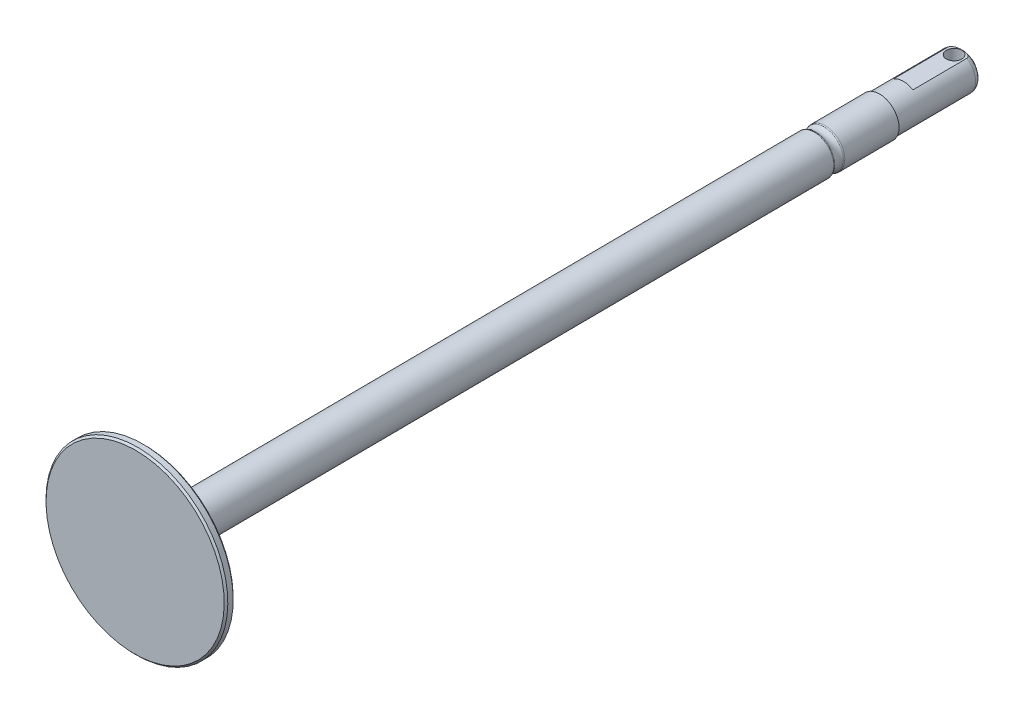
ISO-10303-21;
HEADER;
FILE_DESCRIPTION(('STEP AP214'),'2;1');
FILE_NAME('part.step','',(''),(''),'','','');
FILE_SCHEMA(('AUTOMOTIVE_DESIGN { 1 0 10303 214 1 1 1 1 }'));
ENDSEC;
DATA;
#1=APPLICATION_CONTEXT('core data for automotive mechanical design processes');
#2=APPLICATION_PROTOCOL_DEFINITION('international standard','automotive_design',2000,#1);
#3=PRODUCT_CONTEXT('',#1,'mechanical');
#4=PRODUCT('Part','Part','',(#3));
#5=PRODUCT_RELATED_PRODUCT_CATEGORY('part','',(#4));
#6=PRODUCT_DEFINITION_FORMATION('','',#4);
#7=PRODUCT_DEFINITION_CONTEXT('part definition',#1,'design');
#8=PRODUCT_DEFINITION('design','',#6,#7);
#9=PRODUCT_DEFINITION_SHAPE('','',#8);
#10=(LENGTH_UNIT() NAMED_UNIT(*) SI_UNIT(.MILLI.,.METRE.));
#11=(NAMED_UNIT(*) PLANE_ANGLE_UNIT() SI_UNIT($,.RADIAN.));
#12=(NAMED_UNIT(*) SI_UNIT($,.STERADIAN.) SOLID_ANGLE_UNIT());
#13=UNCERTAINTY_MEASURE_WITH_UNIT(LENGTH_MEASURE(1.E-05),#10,'distance_accuracy_value','');
#14=(GEOMETRIC_REPRESENTATION_CONTEXT(3) GLOBAL_UNCERTAINTY_ASSIGNED_CONTEXT((#13)) GLOBAL_UNIT_ASSIGNED_CONTEXT((#10,
#11,#12)) REPRESENTATION_CONTEXT('',''));
#15=CARTESIAN_POINT('',(0.,0.,0.));
#16=DIRECTION('',(0.,0.,1.));
#17=DIRECTION('',(1.,0.,0.));
#18=AXIS2_PLACEMENT_3D('',#15,#16,#17);
#19=CARTESIAN_POINT('',(6.47143842973443,0.,32.4994135551274));
#20=DIRECTION('',(-0.00691899399214713,0.,-0.99997606347459));
#21=DIRECTION('',(-0.99997606347459,0.,0.00691899399214713));
#22=AXIS2_PLACEMENT_3D('',#19,#20,#21);
#23=CYLINDRICAL_SURFACE('',#22,3.25);
#24=CARTESIAN_POINT('',(6.46400751984752,0.,31.4254522215181));
#25=DIRECTION('',(-0.00691899399214887,0.,-0.99997606347459));
#26=DIRECTION('',(-0.99997606347459,0.,0.00691899399214899));
#27=AXIS2_PLACEMENT_3D('',#24,#25,#26);
#28=CIRCLE('',#27,3.25000000000171);
#29=CARTESIAN_POINT('',(3.21408531355339,0.,31.4479389519926));
#30=VERTEX_POINT('',#29);
#31=EDGE_CURVE('E323',#30,#30,#28,.T.);
#32=ORIENTED_EDGE('',*,*,#31,.F.);
#33=EDGE_LOOP('',(#32));
#34=FACE_BOUND('',#33,.T.);
#35=CARTESIAN_POINT('',(7.20658154140015,0.,138.746870299357));
#36=DIRECTION('',(0.00691899399214702,0.,0.99997606347459));
#37=DIRECTION('',(0.99997606347459,0.,-0.00691899399214702));
#38=AXIS2_PLACEMENT_3D('',#35,#36,#37);
#39=CIRCLE('',#38,3.25);
#40=CARTESIAN_POINT('',(10.4565037476926,0.,138.724383568882));
#41=VERTEX_POINT('',#40);
#42=EDGE_CURVE('E322',#41,#41,#39,.F.);
#43=ORIENTED_EDGE('',*,*,#42,.T.);
#44=EDGE_LOOP('',(#43));
#45=FACE_BOUND('',#44,.T.);
#46=ADVANCED_FACE('F43',(#34,#45),#23,.T.);
#47=CARTESIAN_POINT('',(6.46400751984752,0.,31.4254522215181));
#48=DIRECTION('',(-0.00691899399214887,0.,-0.99997606347459));
#49=DIRECTION('',(-0.99997606347459,0.,0.00691899399214887));
#50=AXIS2_PLACEMENT_3D('',#47,#48,#49);
#51=TOROIDAL_SURFACE('',#50,2.95000000000171,0.3);
#52=ORIENTED_EDGE('',*,*,#31,.T.);
#53=EDGE_LOOP('',(#52));
#54=FACE_BOUND('',#53,.T.);
#55=CARTESIAN_POINT('',(6.46263457453887,0.,31.2270256229448));
#56=DIRECTION('',(0.00691899399215062,0.,0.99997606347459));
#57=DIRECTION('',(0.99997606347459,0.,-0.00691899399215068));
#58=AXIS2_PLACEMENT_3D('',#55,#56,#57);
#59=CIRCLE('',#58,3.17500000000299);
#60=CARTESIAN_POINT('',(9.63755857607368,0.,31.2050578170197));
#61=VERTEX_POINT('',#60);
#62=EDGE_CURVE('E138',#61,#61,#59,.T.);
#63=ORIENTED_EDGE('',*,*,#62,.T.);
#64=EDGE_LOOP('',(#63));
#65=FACE_BOUND('',#64,.T.);
#66=ADVANCED_FACE('F162',(#54,#65),#51,.T.);
#67=CARTESIAN_POINT('',(6.28462559194646,0.,5.50005984131344));
#68=DIRECTION('',(-0.00691899399214713,0.,-0.99997606347459));
#69=DIRECTION('',(-0.99997606347459,0.,0.00691899399214713));
#70=AXIS2_PLACEMENT_3D('',#67,#68,#69);
#71=PLANE('',#70);
#72=CARTESIAN_POINT('',(6.28462559194637,0.,5.50005984131344));
#73=DIRECTION('',(0.00691899399214713,0.,0.99997606347459));
#74=DIRECTION('',(0.99997606347459,0.,-0.00691899399214747));
#75=AXIS2_PLACEMENT_3D('',#72,#73,#74);
#76=CIRCLE('',#75,0.716666666666764);
#77=CARTESIAN_POINT('',(7.00127510410326,0.,5.4951012289524));
#78=VERTEX_POINT('',#77);
#79=CARTESIAN_POINT('',(5.56797607978949,0.,5.50501845367448));
#80=VERTEX_POINT('',#79);
#81=EDGE_CURVE('E133',#78,#80,#76,.T.);
#82=ORIENTED_EDGE('',*,*,#81,.F.);
#83=CARTESIAN_POINT('',(6.28462559194637,0.,5.50005984131344));
#84=DIRECTION('',(0.00691899399214713,0.,0.99997606347459));
#85=DIRECTION('',(-0.99997606347459,0.,0.00691899399214747));
#86=AXIS2_PLACEMENT_3D('',#83,#84,#85);
#87=CIRCLE('',#86,0.716666666666764);
#88=EDGE_CURVE('E128',#80,#78,#87,.T.);
#89=ORIENTED_EDGE('',*,*,#88,.F.);
#90=EDGE_LOOP('',(#82,#89));
#91=FACE_BOUND('',#90,.T.);
#92=ADVANCED_FACE('F142',(#91),#71,.T.);
#93=CARTESIAN_POINT('',(6.45760044174673,0.,30.4994614281782));
#94=DIRECTION('',(0.00691899399215062,0.,0.99997606347459));
#95=DIRECTION('',(0.99997606347459,0.,-0.00691899399215062));
#96=AXIS2_PLACEMENT_3D('',#93,#94,#95);
#97=TOROIDAL_SURFACE('',#96,4.00000000000341,1.1);
#98=ORIENTED_EDGE('',*,*,#62,.F.);
#99=EDGE_LOOP('',(#98));
#100=FACE_BOUND('',#99,.T.);
#101=CARTESIAN_POINT('',(6.45256630895634,0.,29.7718972334184));
#102=DIRECTION('',(0.00691899399214887,0.,0.99997606347459));
#103=DIRECTION('',(0.99997606347459,0.,-0.00691899399214876));
#104=AXIS2_PLACEMENT_3D('',#101,#102,#103);
#105=CIRCLE('',#104,3.17499999999869);
#106=CARTESIAN_POINT('',(9.62749031048685,0.,29.7499294274934));
#107=VERTEX_POINT('',#106);
#108=EDGE_CURVE('E144',#107,#107,#105,.F.);
#109=ORIENTED_EDGE('',*,*,#108,.F.);
#110=EDGE_LOOP('',(#109));
#111=FACE_BOUND('',#110,.T.);
#112=ADVANCED_FACE('F161',(#100,#111),#97,.F.);
#113=CARTESIAN_POINT('',(5.57489507378163,0.,6.50499451714907));
#114=DIRECTION('',(0.,1.,0.));
#115=DIRECTION('',(-0.99997606347459,0.,0.00691899399214713));
#116=AXIS2_PLACEMENT_3D('',#113,#114,#115);
#117=CIRCLE('',#116,1.);
#118=TRIMMED_CURVE('',#117,(PARAMETER_VALUE(-2.36980728294869)),
(PARAMETER_VALUE(2.36980728294869)),.T.,.PARAMETER.);
#119=CARTESIAN_POINT('',(6.29154458593852,0.,6.50003590478803));
#120=DIRECTION('',(-0.00691899399214713,0.,-0.99997606347459));
#121=AXIS1_PLACEMENT('',#119,#120);
#122=SURFACE_OF_REVOLUTION('',#118,#121);
#123=ORIENTED_EDGE('',*,*,#88,.T.);
#124=ORIENTED_EDGE('',*,*,#81,.T.);
#125=EDGE_LOOP('',(#123,#124));
#126=FACE_BOUND('',#125,.T.);
#127=CARTESIAN_POINT('',(6.28600939074497,0.,5.70005505403319));
#128=DIRECTION('',(0.00691899399215062,0.,0.99997606347459));
#129=DIRECTION('',(0.99997606347459,0.,-0.00691899399214976));
#130=AXIS2_PLACEMENT_3D('',#127,#128,#129);
#131=CIRCLE('',#130,1.31666666663942);
#132=CARTESIAN_POINT('',(7.60264454095926,0.,5.69094504527704));
#133=VERTEX_POINT('',#132);
#134=EDGE_CURVE('E192',#133,#133,#131,.T.);
#135=ORIENTED_EDGE('',*,*,#134,.F.);
#136=EDGE_LOOP('',(#135));
#137=FACE_BOUND('',#136,.T.);
#138=ADVANCED_FACE('F131',(#126,#137),#122,.F.);
#139=CARTESIAN_POINT('',(6.45119336364939,0.,29.573470634846));
#140=DIRECTION('',(0.00691899399214887,0.,0.99997606347459));
#141=DIRECTION('',(0.99997606347459,0.,-0.00691899399214887));
#142=AXIS2_PLACEMENT_3D('',#139,#140,#141);
#143=TOROIDAL_SURFACE('',#142,2.9499999999983,0.3);
#144=CARTESIAN_POINT('',(6.4511933636511,0.,29.573470634846));
#145=DIRECTION('',(-0.00691899399214713,0.,-0.99997606347459));
#146=DIRECTION('',(-0.99997606347459,0.,0.00691899399214713));
#147=AXIS2_PLACEMENT_3D('',#144,#145,#146);
#148=CIRCLE('',#147,3.25);
#149=CARTESIAN_POINT('',(3.20127115735869,0.,29.5959573653205));
#150=VERTEX_POINT('',#149);
#151=EDGE_CURVE('E199',#150,#150,#148,.T.);
#152=ORIENTED_EDGE('',*,*,#151,.F.);
#153=EDGE_LOOP('',(#152));
#154=FACE_BOUND('',#153,.T.);
#155=ORIENTED_EDGE('',*,*,#108,.T.);
#156=EDGE_LOOP('',(#155));
#157=FACE_BOUND('',#156,.T.);
#158=ADVANCED_FACE('F186',(#154,#157),#143,.T.);
#159=CARTESIAN_POINT('',(6.30192307692334,-3.24999999999998,7.99999999999993));
#160=DIRECTION('',(0.,1.,0.));
#161=DIRECTION('',(-0.99997606347459,0.,0.00691899399214713));
#162=AXIS2_PLACEMENT_3D('',#159,#160,#161);
#163=CYLINDRICAL_SURFACE('',#162,1.275);
#164=CARTESIAN_POINT('',(6.30192307692334,2.60000000000002,7.99999999999993));
#165=DIRECTION('',(0.,1.,0.));
#166=DIRECTION('',(-0.99997606347459,0.,0.00691899399214713));
#167=AXIS2_PLACEMENT_3D('',#164,#165,#166);
#168=CIRCLE('',#167,1.275);
#169=CARTESIAN_POINT('',(5.02695359599324,2.60000000000002,8.00882171733992));
#170=VERTEX_POINT('',#169);
#171=EDGE_CURVE('E196',#170,#170,#168,.T.);
#172=ORIENTED_EDGE('',*,*,#171,.T.);
#173=EDGE_LOOP('',(#172));
#174=FACE_BOUND('',#173,.T.);
#175=CARTESIAN_POINT('',(6.30192307692334,-2.59999999999998,7.99999999999993));
#176=DIRECTION('',(0.,1.,0.));
#177=DIRECTION('',(-0.99997606347459,0.,0.00691899399214713));
#178=AXIS2_PLACEMENT_3D('',#175,#176,#177);
#179=CIRCLE('',#178,1.275);
#180=CARTESIAN_POINT('',(5.02695359599324,-2.59999999999998,8.00882171733992));
#181=VERTEX_POINT('',#180);
#182=EDGE_CURVE('E223',#181,#181,#179,.F.);
#183=ORIENTED_EDGE('',*,*,#182,.T.);
#184=EDGE_LOOP('',(#183));
#185=FACE_BOUND('',#184,.T.);
#186=ADVANCED_FACE('F355',(#174,#185),#163,.F.);
#187=CARTESIAN_POINT('',(6.29292838473695,0.,6.70003111748414));
#188=DIRECTION('',(0.00691899399215105,0.,0.99997606347459));
#189=DIRECTION('',(0.99997606347459,0.,-0.00691899399215105));
#190=AXIS2_PLACEMENT_3D('',#187,#188,#189);
#191=CONICAL_SURFACE('',#190,2.64999999996017,0.92729521800843);
#192=CARTESIAN_POINT('',(6.29292838473695,0.,6.70003111748294));
#193=DIRECTION('',(-0.00691899399215062,0.,-0.99997606347459));
#194=DIRECTION('',(-0.99997606347459,0.,0.00691899399215105));
#195=AXIS2_PLACEMENT_3D('',#192,#193,#194);
#196=CIRCLE('',#195,2.65000000000009);
#197=CARTESIAN_POINT('',(5.78059311022955,2.60000000000002,6.7035760470267));
#198=VERTEX_POINT('',#197);
#199=CARTESIAN_POINT('',(5.78059311026074,-2.59999999999998,6.70357604703755));
#200=VERTEX_POINT('',#199);
#201=EDGE_CURVE('E203',#198,#200,#196,.F.);
#202=ORIENTED_EDGE('',*,*,#201,.F.);
#203=CARTESIAN_POINT('',(5.78059311023422,2.60000000000002,6.70357604705716));
#204=CARTESIAN_POINT('',(5.86552023323553,2.60000000000002,6.69061135992893));
#205=CARTESIAN_POINT('',(5.95092196332494,2.60000000000002,6.68062820190784));
#206=CARTESIAN_POINT('',(6.12176650438817,2.60000000000002,6.66690060894354));
#207=CARTESIAN_POINT('',(6.20720669140374,2.60000000000002,6.66312334195217));
#208=CARTESIAN_POINT('',(6.37813115349206,2.60000000000002,6.66194068831653));
#209=CARTESIAN_POINT('',(6.46361542856481,2.60000000000002,6.66453530167226));
#210=CARTESIAN_POINT('',(6.63463356984458,2.60000000000002,6.67589749217037));
#211=CARTESIAN_POINT('',(6.72016526666318,2.60000000000002,6.68469793452684));
#212=CARTESIAN_POINT('',(6.80526365921131,2.60000000000002,6.69648618797409));
#213=B_SPLINE_CURVE_WITH_KNOTS('',3,(#203,#204,#205,#206,#207,#208,#209,#210,#211,#212),
.UNSPECIFIED.,.F.,.F.,(4,2,2,2,4),(0.,0.257710646406221,0.514053441173921,0.770396235941627,
1.02810688234785),.UNSPECIFIED.);
#214=CARTESIAN_POINT('',(6.80526365921342,2.60000000000002,6.69648618795882));
#215=VERTEX_POINT('',#214);
#216=EDGE_CURVE('E204',#198,#215,#213,.T.);
#217=ORIENTED_EDGE('',*,*,#216,.T.);
#218=CARTESIAN_POINT('',(6.29292838473695,0.,6.70003111748294));
#219=DIRECTION('',(-0.00691899399215062,0.,-0.99997606347459));
#220=DIRECTION('',(-0.99997606347459,0.,0.00691899399215105));
#221=AXIS2_PLACEMENT_3D('',#218,#219,#220);
#222=CIRCLE('',#221,2.65000000000009);
#223=CARTESIAN_POINT('',(6.80526365921337,-2.59999999999998,6.69648618795881));
#224=VERTEX_POINT('',#223);
#225=EDGE_CURVE('E271',#224,#215,#222,.F.);
#226=ORIENTED_EDGE('',*,*,#225,.F.);
#227=CARTESIAN_POINT('',(6.80526365921122,-2.59999999999998,6.69648618797408));
#228=CARTESIAN_POINT('',(6.72016526666553,-2.59999999999998,6.68469793452717));
#229=CARTESIAN_POINT('',(6.63463356984939,-2.59999999999998,6.67589749217087));
#230=CARTESIAN_POINT('',(6.46361542857452,-2.59999999999998,6.66453530167273));
#231=CARTESIAN_POINT('',(6.3781311535042,-2.59999999999998,6.6619406883168));
#232=CARTESIAN_POINT('',(6.20720669142073,-2.59999999999998,6.66312334195169));
#233=CARTESIAN_POINT('',(6.12176650440756,-2.59999999999998,6.6669006089425));
#234=CARTESIAN_POINT('',(5.95092196334911,-2.59999999999998,6.68062820190536));
#235=CARTESIAN_POINT('',(5.86552023326208,-2.59999999999998,6.69061135992556));
#236=CARTESIAN_POINT('',(5.7805931102631,-2.59999999999998,6.70357604705277));
#237=B_SPLINE_CURVE_WITH_KNOTS('',3,(#227,#228,#229,#230,#231,#232,#233,#234,#235,#236),
.UNSPECIFIED.,.F.,.F.,(4,2,2,2,4),(0.,0.257710646398846,0.514053441159284,0.770396235919723,
1.02810688231857),.UNSPECIFIED.);
#238=EDGE_CURVE('E304',#224,#200,#237,.T.);
#239=ORIENTED_EDGE('',*,*,#238,.T.);
#240=EDGE_LOOP('',(#202,#217,#226,#239));
#241=FACE_BOUND('',#240,.T.);
#242=ORIENTED_EDGE('',*,*,#134,.T.);
#243=EDGE_LOOP('',(#242));
#244=FACE_BOUND('',#243,.T.);
#245=ADVANCED_FACE('F359',(#241,#244),#191,.T.);
#246=CARTESIAN_POINT('',(-10.1388705214707,3.25000000000002,16.6139599404043));
#247=DIRECTION('',(0.00691899399214713,0.,0.99997606347459));
#248=DIRECTION('',(0.99997606347459,0.,-0.00691899399214713));
#249=AXIS2_PLACEMENT_3D('',#246,#247,#248);
#250=PLANE('',#249);
#251=CARTESIAN_POINT('',(6.36073452586002,0.,16.499796539534));
#252=DIRECTION('',(0.00691899399215062,0.,0.99997606347459));
#253=DIRECTION('',(0.99997606347459,0.,-0.00691899399215062));
#254=AXIS2_PLACEMENT_3D('',#251,#252,#253);
#255=CIRCLE('',#254,3.05000000000008);
#256=CARTESIAN_POINT('',(7.95521823045706,2.60000000000002,16.4887640522819));
#257=VERTEX_POINT('',#256);
#258=CARTESIAN_POINT('',(4.76625082126298,2.60000000000002,16.5108290267861));
#259=VERTEX_POINT('',#258);
#260=EDGE_CURVE('E208',#257,#259,#255,.T.);
#261=ORIENTED_EDGE('',*,*,#260,.F.);
#262=DIRECTION('',(0.99997606347459,0.,-0.00691899399214713));
#263=VECTOR('',#262,1.);
#264=CARTESIAN_POINT('',(-10.1388705214707,2.60000000000002,16.6139599404045));
#265=LINE('',#264,#263);
#266=EDGE_CURVE('E114',#257,#259,#265,.F.);
#267=ORIENTED_EDGE('',*,*,#266,.T.);
#268=EDGE_LOOP('',(#261,#267));
#269=FACE_BOUND('',#268,.T.);
#270=ADVANCED_FACE('F261',(#269),#250,.F.);
#271=CARTESIAN_POINT('',(-10.1388705214707,2.60000000000002,16.6139599404043));
#272=DIRECTION('',(0.,-1.,0.));
#273=DIRECTION('',(-0.00691899399214713,0.,-0.99997606347459));
#274=AXIS2_PLACEMENT_3D('',#271,#272,#273);
#275=PLANE('',#274);
#276=CARTESIAN_POINT('',(4.70397987533363,2.60000000000002,7.5110444555147));
#277=CARTESIAN_POINT('',(4.70384987644721,2.60000000000002,7.49290841887377));
#278=CARTESIAN_POINT('',(4.70467367993067,2.60000000000002,7.4747792306576));
#279=CARTESIAN_POINT('',(4.70817762205473,2.60000000000002,7.43872032171689));
#280=CARTESIAN_POINT('',(4.71085575720852,2.60000000000002,7.42079040691319));
#281=CARTESIAN_POINT('',(4.72151035677255,2.60000000000002,7.36795172331959));
#282=CARTESIAN_POINT('',(4.73210683583856,2.60000000000002,7.33354430287102));
#283=CARTESIAN_POINT('',(4.75931961074297,2.60000000000002,7.26743057494155));
#284=CARTESIAN_POINT('',(4.77591271055891,2.60000000000002,7.23571443303589));
#285=CARTESIAN_POINT('',(4.81399534252052,2.60000000000002,7.17529865328853));
#286=CARTESIAN_POINT('',(4.83549871942386,2.60000000000002,7.14660788654726));
#287=CARTESIAN_POINT('',(4.89191934875167,2.60000000000002,7.08134381848383));
#288=CARTESIAN_POINT('',(4.92871113766357,2.60000000000002,7.04639998413353));
#289=CARTESIAN_POINT('',(5.00728682887246,2.60000000000002,6.98272702596022));
#290=CARTESIAN_POINT('',(5.04908010401538,2.60000000000001,6.95400986324759));
#291=CARTESIAN_POINT('',(5.16383022771077,2.60000000000001,6.88534773186314));
#292=CARTESIAN_POINT('',(5.23954402733486,2.60000000000002,6.850058458898));
#293=CARTESIAN_POINT('',(5.3952448432293,2.60000000000002,6.79081299539318));
#294=CARTESIAN_POINT('',(5.47524336906396,2.60000000000002,6.76688922834342));
#295=CARTESIAN_POINT('',(5.59338878295469,2.60000000000002,6.73829565222909));
#296=CARTESIAN_POINT('',(5.63075729257948,2.60000000000002,6.73021238396721));
#297=CARTESIAN_POINT('',(5.70558026739417,2.60000000000002,6.71571581567108));
#298=CARTESIAN_POINT('',(5.74303279523037,2.60000000000002,6.70929256443689));
#299=CARTESIAN_POINT('',(5.78059311022959,2.60000000000002,6.7035760470267));
#300=B_SPLINE_CURVE_WITH_KNOTS('',3,(#276,#277,#278,#279,#280,#281,#282,#283,#284,#285,#286,
#287,#288,#289,#290,#291,#292,#293,#294,#295,#296,#297,#298,#299),.UNSPECIFIED.,.F.,.F.,(4,2,2,
2,2,2,2,2,2,2,2,4),(0.,0.0543595006208801,0.108660360737125,0.215938070539347,0.322805175998552,
0.429977402492625,0.581352056766434,0.733014967075773,0.982209476205452,1.23211068022507,
1.34678143385737,1.46074793888463),.UNSPECIFIED.);
#301=CARTESIAN_POINT('',(4.70397987533363,2.60000000000002,7.5110444555147));
#302=VERTEX_POINT('',#301);
#303=EDGE_CURVE('E212',#302,#198,#300,.T.);
#304=ORIENTED_EDGE('',*,*,#303,.F.);
#305=DIRECTION('',(0.00691899399215062,0.,0.99997606347459));
#306=VECTOR('',#305,1.);
#307=CARTESIAN_POINT('',(11.8028677112802,2.59999999999979,1033.48648558044));
#308=LINE('',#307,#306);
#309=EDGE_CURVE('E213',#259,#302,#308,.F.);
#310=ORIENTED_EDGE('',*,*,#309,.F.);
#311=ORIENTED_EDGE('',*,*,#266,.F.);
#312=DIRECTION('',(0.00691899399215062,0.,0.99997606347459));
#313=VECTOR('',#312,1.);
#314=CARTESIAN_POINT('',(14.9918351204742,2.59999999999979,1033.46442060594));
#315=LINE('',#314,#313);
#316=CARTESIAN_POINT('',(7.8929472845277,2.60000000000002,7.48897948101051));
#317=VERTEX_POINT('',#316);
#318=EDGE_CURVE('E205',#317,#257,#315,.T.);
#319=ORIENTED_EDGE('',*,*,#318,.F.);
#320=CARTESIAN_POINT('',(6.80526365921553,2.60000000000002,6.69648618794356));
#321=CARTESIAN_POINT('',(6.8561154976496,2.60000000000002,6.70352634348705));
#322=CARTESIAN_POINT('',(6.9068293715514,2.60000000000002,6.71183531196478));
#323=CARTESIAN_POINT('',(7.00787456033053,2.60000000000002,6.73156842313693));
#324=CARTESIAN_POINT('',(7.05820318585411,2.60000000000002,6.74300620065973));
#325=CARTESIAN_POINT('',(7.15863558469799,2.60000000000002,6.76971330964486));
#326=CARTESIAN_POINT('',(7.20872559122189,2.60000000000002,6.78503563745771));
#327=CARTESIAN_POINT('',(7.30724687635603,2.60000000000002,6.82012973000199));
#328=CARTESIAN_POINT('',(7.35568118605749,2.60000000000002,6.83989279999233));
#329=CARTESIAN_POINT('',(7.4458536808667,2.60000000000002,6.8827245761694));
#330=CARTESIAN_POINT('',(7.48780361177337,2.60000000000003,6.9053405613773));
#331=CARTESIAN_POINT('',(7.56852650767192,2.60000000000001,6.95562734933633));
#332=CARTESIAN_POINT('',(7.60730455729318,2.59999999999997,6.98328982290031));
#333=CARTESIAN_POINT('',(7.6807406333427,2.60000000000003,7.04473791282664));
#334=CARTESIAN_POINT('',(7.71532996694611,2.60000000000013,7.07860730821165));
#335=CARTESIAN_POINT('',(7.7773368040371,2.59999999999991,7.15241010268089));
#336=CARTESIAN_POINT('',(7.80477485927188,2.5999999999996,7.19232559149439));
#337=CARTESIAN_POINT('',(7.84177699491922,2.59999999999973,7.2624224590737));
#338=CARTESIAN_POINT('',(7.85423315948979,2.59999999999994,7.2910862113278));
#339=CARTESIAN_POINT('',(7.87421840865154,2.60000000000009,7.3500668753495));
#340=CARTESIAN_POINT('',(7.88175801621602,2.60000000000003,7.38038010494399));
#341=CARTESIAN_POINT('',(7.88860703832785,2.60000000000001,7.42397173510465));
#342=CARTESIAN_POINT('',(7.89015347167473,2.60000000000002,7.43692704495919));
#343=CARTESIAN_POINT('',(7.89227839762122,2.60000000000002,7.46291142619274));
#344=CARTESIAN_POINT('',(7.89285728328814,2.60000000000003,7.47594046545958));
#345=CARTESIAN_POINT('',(7.8929472845277,2.60000000000002,7.48897948101051));
#346=B_SPLINE_CURVE_WITH_KNOTS('',3,(#320,#321,#322,#323,#324,#325,#326,#327,#328,#329,#330,
#331,#332,#333,#334,#335,#336,#337,#338,#339,#340,#341,#342,#343,#344,#345),.UNSPECIFIED.,.F.,
.F.,(4,2,2,2,2,2,2,2,2,2,2,2,4),(0.,0.154050765632774,0.308783858109109,0.465753667288842,
0.622418775181398,0.765095356129827,0.907538546731808,1.05206885101856,1.1961790981966,
1.28957553046733,1.38277140321643,1.42188324686408,1.46097919741619),.UNSPECIFIED.);
#347=EDGE_CURVE('E209',#215,#317,#346,.T.);
#348=ORIENTED_EDGE('',*,*,#347,.F.);
#349=ORIENTED_EDGE('',*,*,#216,.F.);
#350=EDGE_LOOP('',(#304,#310,#311,#319,#348,#349));
#351=FACE_BOUND('',#350,.T.);
#352=ORIENTED_EDGE('',*,*,#171,.F.);
#353=EDGE_LOOP('',(#352));
#354=FACE_BOUND('',#353,.T.);
#355=ADVANCED_FACE('F257',(#351,#354),#275,.F.);
#356=CARTESIAN_POINT('',(6.47143842973443,0.,32.4994135551274));
#357=DIRECTION('',(-0.00691899399214713,0.,-0.99997606347459));
#358=DIRECTION('',(-0.99997606347459,0.,0.00691899399214713));
#359=AXIS2_PLACEMENT_3D('',#356,#357,#358);
#360=CYLINDRICAL_SURFACE('',#359,3.25);
#361=ORIENTED_EDGE('',*,*,#151,.T.);
#362=EDGE_LOOP('',(#361));
#363=FACE_BOUND('',#362,.T.);
#364=CARTESIAN_POINT('',(6.38841050182867,0.,20.4997007934323));
#365=DIRECTION('',(-0.00691899399214713,0.,-0.99997606347459));
#366=DIRECTION('',(-0.99997606347459,0.,0.00691899399214713));
#367=AXIS2_PLACEMENT_3D('',#364,#365,#366);
#368=CIRCLE('',#367,3.25);
#369=CARTESIAN_POINT('',(3.13848829553625,0.,20.5221875239068));
#370=VERTEX_POINT('',#369);
#371=EDGE_CURVE('E217',#370,#370,#368,.F.);
#372=ORIENTED_EDGE('',*,*,#371,.T.);
#373=EDGE_LOOP('',(#372));
#374=FACE_BOUND('',#373,.T.);
#375=ADVANCED_FACE('F235',(#363,#374),#360,.T.);
#376=CARTESIAN_POINT('',(6.29846357993067,0.,7.5000119682626));
#377=DIRECTION('',(-0.00691899399215062,0.,-0.99997606347459));
#378=DIRECTION('',(-0.99997606347459,0.,0.00691899399215062));
#379=AXIS2_PLACEMENT_3D('',#376,#377,#378);
#380=TOROIDAL_SURFACE('',#379,2.05000000000008,1.);
#381=ORIENTED_EDGE('',*,*,#201,.T.);
#382=CARTESIAN_POINT('',(5.78059311025847,-2.59999999999998,6.7035760470223));
#383=CARTESIAN_POINT('',(5.7298435598873,-2.59999999999998,6.71131919879181));
#384=CARTESIAN_POINT('',(5.67924951823685,-2.59999999999998,6.72032913290729));
#385=CARTESIAN_POINT('',(5.57848706404387,-2.59999999999998,6.74145858337225));
#386=CARTESIAN_POINT('',(5.52832152927166,-2.59999999999998,6.75359169603028));
#387=CARTESIAN_POINT('',(5.4282683101303,-2.59999999999998,6.78168599700631));
#388=CARTESIAN_POINT('',(5.37839512458475,-2.59999999999998,6.7976999861005));
#389=CARTESIAN_POINT('',(5.2803688923733,-2.59999999999998,6.83415402228879));
#390=CARTESIAN_POINT('',(5.23221269459154,-2.59999999999998,6.85458541741749));
#391=CARTESIAN_POINT('',(5.14264152476062,-2.59999999999998,6.89866086869959));
#392=CARTESIAN_POINT('',(5.10100856258862,-2.59999999999999,6.92185517728559));
#393=CARTESIAN_POINT('',(5.02098924681104,-2.59999999999997,6.97325416626373));
#394=CARTESIAN_POINT('',(4.98259769380648,-2.59999999999994,7.00145058862553));
#395=CARTESIAN_POINT('',(4.91001894646721,-2.6,7.06390897842072));
#396=CARTESIAN_POINT('',(4.87590159768571,-2.60000000000009,7.09825376630762));
#397=CARTESIAN_POINT('',(4.81492195517371,-2.59999999999987,7.17290752385945));
#398=CARTESIAN_POINT('',(4.78803886382756,-2.59999999999957,7.21319886935649));
#399=CARTESIAN_POINT('',(4.75201024734093,-2.59999999999969,7.28380104836646));
#400=CARTESIAN_POINT('',(4.73995191455017,-2.59999999999991,7.31263442034063));
#401=CARTESIAN_POINT('',(4.72078473305888,-2.60000000000006,7.37188598627924));
#402=CARTESIAN_POINT('',(4.71366531143994,-2.6,7.40230064403642));
#403=CARTESIAN_POINT('',(4.70742015110281,-2.59999999999998,7.44598287493545));
#404=CARTESIAN_POINT('',(4.70605313694998,-2.59999999999998,7.45895834339827));
#405=CARTESIAN_POINT('',(4.70428797740283,-2.59999999999999,7.48496964075426));
#406=CARTESIAN_POINT('',(4.70388943853446,-2.59999999999999,7.49800544297747));
#407=CARTESIAN_POINT('',(4.70397987533363,-2.59999999999998,7.5110444555147));
#408=B_SPLINE_CURVE_WITH_KNOTS('',3,(#382,#383,#384,#385,#386,#387,#388,#389,#390,#391,#392,
#393,#394,#395,#396,#397,#398,#399,#400,#401,#402,#403,#404,#405,#406,#407),.UNSPECIFIED.,.F.,
.F.,(4,2,2,2,2,2,2,2,2,2,2,2,4),(0.,0.154050765632784,0.308783858109128,0.465753667288872,
0.622418775181439,0.765095356129876,0.907538546731866,1.05206885101862,1.19617909819667,
1.28957553046741,1.38277140321651,1.42188324686416,1.46097919741628),.UNSPECIFIED.);
#409=CARTESIAN_POINT('',(4.70397987533363,-2.59999999999998,7.51104445551469));
#410=VERTEX_POINT('',#409);
#411=EDGE_CURVE('E240',#200,#410,#408,.T.);
#412=ORIENTED_EDGE('',*,*,#411,.T.);
#413=CARTESIAN_POINT('',(6.29846357993067,0.,7.5000119682626));
#414=DIRECTION('',(0.00691899399215062,0.,0.99997606347459));
#415=DIRECTION('',(0.99997606347459,0.,-0.00691899399215062));
#416=AXIS2_PLACEMENT_3D('',#413,#414,#415);
#417=CIRCLE('',#416,3.05000000000008);
#418=EDGE_CURVE('E97',#302,#410,#417,.T.);
#419=ORIENTED_EDGE('',*,*,#418,.F.);
#420=ORIENTED_EDGE('',*,*,#303,.T.);
#421=EDGE_LOOP('',(#381,#412,#419,#420));
#422=FACE_BOUND('',#421,.T.);
#423=ADVANCED_FACE('F229',(#422),#380,.T.);
#424=CARTESIAN_POINT('',(-10.1388705214707,-3.24999999999998,16.6139599404043));
#425=DIRECTION('',(0.00691899399214713,0.,0.99997606347459));
#426=DIRECTION('',(0.99997606347459,0.,-0.00691899399214713));
#427=AXIS2_PLACEMENT_3D('',#424,#425,#426);
#428=PLANE('',#427);
#429=CARTESIAN_POINT('',(6.36073452586002,0.,16.499796539534));
#430=DIRECTION('',(0.00691899399215062,0.,0.99997606347459));
#431=DIRECTION('',(0.99997606347459,0.,-0.00691899399215062));
#432=AXIS2_PLACEMENT_3D('',#429,#430,#431);
#433=CIRCLE('',#432,3.05000000000008);
#434=CARTESIAN_POINT('',(4.76625082126298,-2.59999999999998,16.5108290267861));
#435=VERTEX_POINT('',#434);
#436=CARTESIAN_POINT('',(7.95521823045705,-2.59999999999999,16.4887640522819));
#437=VERTEX_POINT('',#436);
#438=EDGE_CURVE('E300',#435,#437,#433,.T.);
#439=ORIENTED_EDGE('',*,*,#438,.F.);
#440=DIRECTION('',(0.99997606347459,0.,-0.00691899399214713));
#441=VECTOR('',#440,1.);
#442=CARTESIAN_POINT('',(-10.1388705214707,-2.59999999999998,16.6139599404045));
#443=LINE('',#442,#441);
#444=EDGE_CURVE('E301',#435,#437,#443,.T.);
#445=ORIENTED_EDGE('',*,*,#444,.T.);
#446=EDGE_LOOP('',(#439,#445));
#447=FACE_BOUND('',#446,.T.);
#448=ADVANCED_FACE('F234',(#447),#428,.F.);
#449=CARTESIAN_POINT('',(-10.1388705214707,-2.59999999999998,16.6139599404043));
#450=DIRECTION('',(0.,1.,0.));
#451=DIRECTION('',(0.00691899399214713,0.,0.99997606347459));
#452=AXIS2_PLACEMENT_3D('',#449,#450,#451);
#453=PLANE('',#452);
#454=ORIENTED_EDGE('',*,*,#411,.F.);
#455=ORIENTED_EDGE('',*,*,#238,.F.);
#456=CARTESIAN_POINT('',(7.8929472845277,-2.59999999999998,7.4889794810105));
#457=CARTESIAN_POINT('',(7.89282631071752,-2.59999999999998,7.47084338192363));
#458=CARTESIAN_POINT('',(7.89175172062538,-2.59999999999998,7.45272732899561));
#459=CARTESIAN_POINT('',(7.88774914318137,-2.59999999999998,7.41672035886193));
#460=CARTESIAN_POINT('',(7.88482315643889,-2.59999999999998,7.39882921987212));
#461=CARTESIAN_POINT('',(7.87343841343228,-2.59999999999998,7.34614303000753));
#462=CARTESIAN_POINT('',(7.86236683085184,-2.59999999999998,7.31188553433599));
#463=CARTESIAN_POINT('',(7.83424180235975,-2.59999999999998,7.24615469750085));
#464=CARTESIAN_POINT('',(7.81721141416426,-2.59999999999998,7.21467120187547));
#465=CARTESIAN_POINT('',(7.77829641560007,-2.59999999999998,7.15478818102353));
#466=CARTESIAN_POINT('',(7.75639808455452,-2.59999999999998,7.12639771762703));
#467=CARTESIAN_POINT('',(7.69907975544533,-2.59999999999998,7.06192062757122));
#468=CARTESIAN_POINT('',(7.66180794837633,-2.59999999999998,7.02748925106301));
#469=CARTESIAN_POINT('',(7.582358695854,-2.59999999999998,6.96490969269818));
#470=CARTESIAN_POINT('',(7.54017204396588,-2.59999999999998,6.93677360050495));
#471=CARTESIAN_POINT('',(7.42448278401013,-2.59999999999998,6.86970591599706));
#472=CARTESIAN_POINT('',(7.34828791275416,-2.59999999999998,6.8354677233723));
#473=CARTESIAN_POINT('',(7.19178218603943,-2.59999999999998,6.77838246676796));
#474=CARTESIAN_POINT('',(7.11146027078345,-2.59999999999998,6.75556798243929));
#475=CARTESIAN_POINT('',(6.99293050062379,-2.59999999999998,6.72861199969867));
#476=CARTESIAN_POINT('',(6.95545371534884,-2.59999999999998,6.72104659797758));
#477=CARTESIAN_POINT('',(6.88043730591075,-2.59999999999998,6.70758679229599));
#478=CARTESIAN_POINT('',(6.84289948121453,-2.59999999999998,6.70168241127991));
#479=CARTESIAN_POINT('',(6.80526365921543,-2.59999999999998,6.69648618794355));
#480=B_SPLINE_CURVE_WITH_KNOTS('',3,(#456,#457,#458,#459,#460,#461,#462,#463,#464,#465,#466,
#467,#468,#469,#470,#471,#472,#473,#474,#475,#476,#477,#478,#479),.UNSPECIFIED.,.F.,.F.,(4,2,2,
2,2,2,2,2,2,2,2,4),(0.,0.0543595006208795,0.108660360737124,0.215938070539345,0.322805175998548,
0.42997740249262,0.58135205676643,0.733014967075762,0.982209476205401,1.23211068022505,
1.34678143387205,1.46074793891383),.UNSPECIFIED.);
#481=CARTESIAN_POINT('',(7.8929472845277,-2.59999999999999,7.48897948101051));
#482=VERTEX_POINT('',#481);
#483=EDGE_CURVE('E64',#482,#224,#480,.T.);
#484=ORIENTED_EDGE('',*,*,#483,.F.);
#485=DIRECTION('',(0.00691899399215062,0.,0.99997606347459));
#486=VECTOR('',#485,1.);
#487=CARTESIAN_POINT('',(14.9918351204742,-2.60000000000022,1033.46442060594));
#488=LINE('',#487,#486);
#489=EDGE_CURVE('E297',#437,#482,#488,.F.);
#490=ORIENTED_EDGE('',*,*,#489,.F.);
#491=ORIENTED_EDGE('',*,*,#444,.F.);
#492=DIRECTION('',(0.00691899399215062,0.,0.99997606347459));
#493=VECTOR('',#492,1.);
#494=CARTESIAN_POINT('',(11.8028677112802,-2.60000000000021,1033.48648558044));
#495=LINE('',#494,#493);
#496=EDGE_CURVE('E305',#410,#435,#495,.T.);
#497=ORIENTED_EDGE('',*,*,#496,.F.);
#498=EDGE_LOOP('',(#454,#455,#484,#490,#491,#497));
#499=FACE_BOUND('',#498,.T.);
#500=ORIENTED_EDGE('',*,*,#182,.F.);
#501=EDGE_LOOP('',(#500));
#502=FACE_BOUND('',#501,.T.);
#503=ADVANCED_FACE('F282',(#499,#502),#453,.F.);
#504=CARTESIAN_POINT('',(6.29846357993067,0.,7.5000119682626));
#505=DIRECTION('',(-0.00691899399215062,0.,-0.99997606347459));
#506=DIRECTION('',(-0.99997606347459,0.,0.00691899399215062));
#507=AXIS2_PLACEMENT_3D('',#504,#505,#506);
#508=TOROIDAL_SURFACE('',#507,2.05000000000008,1.);
#509=ORIENTED_EDGE('',*,*,#347,.T.);
#510=CARTESIAN_POINT('',(6.29846357993067,0.,7.5000119682626));
#511=DIRECTION('',(0.00691899399215062,0.,0.99997606347459));
#512=DIRECTION('',(0.99997606347459,0.,-0.00691899399215062));
#513=AXIS2_PLACEMENT_3D('',#510,#511,#512);
#514=CIRCLE('',#513,3.05000000000008);
#515=EDGE_CURVE('E106',#482,#317,#514,.T.);
#516=ORIENTED_EDGE('',*,*,#515,.F.);
#517=ORIENTED_EDGE('',*,*,#483,.T.);
#518=ORIENTED_EDGE('',*,*,#225,.T.);
#519=EDGE_LOOP('',(#509,#516,#517,#518));
#520=FACE_BOUND('',#519,.T.);
#521=ADVANCED_FACE('F276',(#520),#508,.T.);
#522=CARTESIAN_POINT('',(10.169408866543,0.,20.4735394622511));
#523=DIRECTION('',(0.00691899399215062,0.,0.99997606347459));
#524=DIRECTION('',(0.99997606347459,0.,-0.00691899399215062));
#525=AXIS2_PLACEMENT_3D('',#522,#523,#524);
#526=PLANE('',#525);
#527=ORIENTED_EDGE('',*,*,#371,.F.);
#528=EDGE_LOOP('',(#527));
#529=FACE_BOUND('',#528,.T.);
#530=CARTESIAN_POINT('',(6.38841050182862,0.,20.4997007934324));
#531=DIRECTION('',(0.00691899399215062,0.,0.99997606347459));
#532=DIRECTION('',(0.99997606347459,0.,-0.00691899399215062));
#533=AXIS2_PLACEMENT_3D('',#530,#531,#532);
#534=CIRCLE('',#533,3.05000000000008);
#535=CARTESIAN_POINT('',(9.4383374954262,0.,20.4785978617563));
#536=VERTEX_POINT('',#535);
#537=EDGE_CURVE('E319',#536,#536,#534,.F.);
#538=ORIENTED_EDGE('',*,*,#537,.F.);
#539=EDGE_LOOP('',(#538));
#540=FACE_BOUND('',#539,.T.);
#541=ADVANCED_FACE('F281',(#529,#540),#526,.F.);
#542=CARTESIAN_POINT('',(13.3973514158772,-2.10823680776953E-13,1033.47545309319));
#543=DIRECTION('',(0.00691899399215062,0.,0.99997606347459));
#544=DIRECTION('',(0.99997606347459,0.,-0.00691899399215062));
#545=AXIS2_PLACEMENT_3D('',#542,#543,#544);
#546=CYLINDRICAL_SURFACE('',#545,3.05000000000008);
#547=ORIENTED_EDGE('',*,*,#309,.T.);
#548=ORIENTED_EDGE('',*,*,#418,.T.);
#549=ORIENTED_EDGE('',*,*,#496,.T.);
#550=ORIENTED_EDGE('',*,*,#438,.T.);
#551=ORIENTED_EDGE('',*,*,#489,.T.);
#552=ORIENTED_EDGE('',*,*,#515,.T.);
#553=ORIENTED_EDGE('',*,*,#318,.T.);
#554=ORIENTED_EDGE('',*,*,#260,.T.);
#555=EDGE_LOOP('',(#547,#548,#549,#550,#551,#552,#553,#554));
#556=FACE_BOUND('',#555,.T.);
#557=ORIENTED_EDGE('',*,*,#537,.T.);
#558=EDGE_LOOP('',(#557));
#559=FACE_BOUND('',#558,.T.);
#560=ADVANCED_FACE('F380',(#556,#559),#546,.T.);
#561=CARTESIAN_POINT('',(7.24982525385069,0.,144.996720696019));
#562=DIRECTION('',(-0.00691899399214702,0.,-0.99997606347459));
#563=DIRECTION('',(0.75678838743918,0.653638980924731,-0.00523633964579507));
#564=AXIS2_PLACEMENT_3D('',#561,#562,#563);
#565=PLANE('',#564);
#566=CARTESIAN_POINT('',(7.24982525385069,0.,144.996720696019));
#567=DIRECTION('',(-0.00691899399214702,0.,-0.99997606347459));
#568=DIRECTION('',(0.75678838743918,0.653638980924731,-0.00523633964579507));
#569=AXIS2_PLACEMENT_3D('',#566,#567,#568);
#570=CIRCLE('',#569,14.7);
#571=CARTESIAN_POINT('',(18.3746145492066,9.60849301959352,144.919746503226));
#572=VERTEX_POINT('',#571);
#573=EDGE_CURVE('E326',#572,#572,#570,.T.);
#574=ORIENTED_EDGE('',*,*,#573,.F.);
#575=EDGE_LOOP('',(#574));
#576=FACE_BOUND('',#575,.T.);
#577=ADVANCED_FACE('F382',(#576),#565,.F.);
#578=CARTESIAN_POINT('',(7.24774955565305,0.,144.696727876976));
#579=DIRECTION('',(-0.00691899399214702,0.,-0.99997606347459));
#580=DIRECTION('',(0.75678838743918,0.653638980924731,-0.00523633964579507));
#581=AXIS2_PLACEMENT_3D('',#578,#579,#580);
#582=CONICAL_SURFACE('',#581,15.,0.785398163397454);
#583=ORIENTED_EDGE('',*,*,#573,.T.);
#584=EDGE_LOOP('',(#583));
#585=FACE_BOUND('',#584,.T.);
#586=CARTESIAN_POINT('',(7.24774955565305,0.,144.696727876976));
#587=DIRECTION('',(-0.00691899399214702,0.,-0.99997606347459));
#588=DIRECTION('',(0.75678838743918,0.653638980924731,-0.0052363396457951));
#589=AXIS2_PLACEMENT_3D('',#586,#587,#588);
#590=CIRCLE('',#589,15.);
#591=CARTESIAN_POINT('',(18.5995753672407,9.80458471387093,144.618182782289));
#592=VERTEX_POINT('',#591);
#593=EDGE_CURVE('E334',#592,#592,#590,.F.);
#594=ORIENTED_EDGE('',*,*,#593,.T.);
#595=EDGE_LOOP('',(#594));
#596=FACE_BOUND('',#595,.T.);
#597=ADVANCED_FACE('F386',(#585,#596),#582,.T.);
#598=CARTESIAN_POINT('',(7.23944676286247,0.,143.496756600807));
#599=DIRECTION('',(0.00691899399214702,0.,0.99997606347459));
#600=DIRECTION('',(-0.75678838743918,-0.653638980924731,0.00523633964579507));
#601=AXIS2_PLACEMENT_3D('',#598,#599,#600);
#602=CYLINDRICAL_SURFACE('',#601,15.);
#603=CARTESIAN_POINT('',(7.24152246106012,0.,143.796749419849));
#604=DIRECTION('',(0.00691899399214702,0.,0.99997606347459));
#605=DIRECTION('',(-0.75678838743918,-0.653638980924731,0.00523633964579507));
#606=AXIS2_PLACEMENT_3D('',#603,#604,#605);
#607=CIRCLE('',#606,15.);
#608=CARTESIAN_POINT('',(-4.11030335052757,-9.80458471387099,143.875294514536));
#609=VERTEX_POINT('',#608);
#610=EDGE_CURVE('E341',#609,#609,#607,.T.);
#611=ORIENTED_EDGE('',*,*,#610,.T.);
#612=EDGE_LOOP('',(#611));
#613=FACE_BOUND('',#612,.T.);
#614=ORIENTED_EDGE('',*,*,#593,.F.);
#615=EDGE_LOOP('',(#614));
#616=FACE_BOUND('',#615,.T.);
#617=ADVANCED_FACE('F407',(#613,#616),#602,.T.);
#618=CARTESIAN_POINT('',(7.24152246106012,0.,143.796749419849));
#619=DIRECTION('',(0.00691899399214702,0.,0.99997606347459));
#620=DIRECTION('',(-0.75678838743918,-0.653638980924731,0.00523633964579507));
#621=AXIS2_PLACEMENT_3D('',#618,#619,#620);
#622=CONICAL_SURFACE('',#621,15.,0.78539816339745);
#623=CARTESIAN_POINT('',(7.23944676286247,0.,143.496756600807));
#624=DIRECTION('',(0.00691899399214702,0.,0.99997606347459));
#625=DIRECTION('',(-0.75678838743918,-0.653638980924731,0.00523633964579507));
#626=AXIS2_PLACEMENT_3D('',#623,#624,#625);
#627=CIRCLE('',#626,14.7);
#628=CARTESIAN_POINT('',(-3.88534253249345,-9.60849301959355,143.5737307936));
#629=VERTEX_POINT('',#628);
#630=EDGE_CURVE('E347',#629,#629,#627,.T.);
#631=ORIENTED_EDGE('',*,*,#630,.T.);
#632=EDGE_LOOP('',(#631));
#633=FACE_BOUND('',#632,.T.);
#634=ORIENTED_EDGE('',*,*,#610,.F.);
#635=EDGE_LOOP('',(#634));
#636=FACE_BOUND('',#635,.T.);
#637=ADVANCED_FACE('F403',(#633,#636),#622,.T.);
#638=CARTESIAN_POINT('',(7.23944676286247,0.,143.496756600807));
#639=DIRECTION('',(-0.00691899399214702,0.,-0.99997606347459));
#640=DIRECTION('',(0.75678838743918,0.653638980924731,-0.00523633964579507));
#641=AXIS2_PLACEMENT_3D('',#638,#639,#640);
#642=PLANE('',#641);
#643=CARTESIAN_POINT('',(7.23944676286247,0.,143.496756600807));
#644=DIRECTION('',(-0.00691899399214702,0.,-0.99997606347459));
#645=DIRECTION('',(-0.99997606347459,0.,0.00691899399214702));
#646=AXIS2_PLACEMENT_3D('',#643,#644,#645);
#647=CIRCLE('',#646,4.57);
#648=CARTESIAN_POINT('',(2.6695561527836,0.,143.528376403351));
#649=VERTEX_POINT('',#648);
#650=EDGE_CURVE('E53',#649,#649,#647,.F.);
#651=ORIENTED_EDGE('',*,*,#650,.T.);
#652=EDGE_LOOP('',(#651));
#653=FACE_BOUND('',#652,.T.);
#654=ORIENTED_EDGE('',*,*,#630,.F.);
#655=EDGE_LOOP('',(#654));
#656=FACE_BOUND('',#655,.T.);
#657=ADVANCED_FACE('F399',(#653,#656),#642,.T.);
#658=CARTESIAN_POINT('',(7.20485179290174,0.,138.496876283434));
#659=DIRECTION('',(0.00691899399214702,0.,0.99997606347459));
#660=DIRECTION('',(-0.75678838743918,-0.653638980924731,0.00523633964579507));
#661=AXIS2_PLACEMENT_3D('',#658,#659,#660);
#662=CYLINDRICAL_SURFACE('',#661,3.3);
#663=CARTESIAN_POINT('',(7.23065964049245,0.,142.226787000194));
#664=DIRECTION('',(-0.00691899399214702,0.,-0.99997606347459));
#665=DIRECTION('',(-0.99997606347459,0.,0.00691899399214702));
#666=AXIS2_PLACEMENT_3D('',#663,#664,#665);
#667=CIRCLE('',#666,3.3);
#668=CARTESIAN_POINT('',(3.9307386310263,0.,142.249619680368));
#669=VERTEX_POINT('',#668);
#670=EDGE_CURVE('E11',#669,#669,#667,.T.);
#671=ORIENTED_EDGE('',*,*,#670,.T.);
#672=EDGE_LOOP('',(#671));
#673=FACE_BOUND('',#672,.T.);
#674=CARTESIAN_POINT('',(7.20692749109938,0.,138.796869102476));
#675=DIRECTION('',(0.00691899399214702,0.,0.99997606347459));
#676=DIRECTION('',(-0.75678838743918,-0.653638980924731,0.00523633964579507));
#677=AXIS2_PLACEMENT_3D('',#674,#675,#676);
#678=CIRCLE('',#677,3.3);
#679=CARTESIAN_POINT('',(4.70952581255009,-2.15700863705164,138.814149023307));
#680=VERTEX_POINT('',#679);
#681=EDGE_CURVE('E345',#680,#680,#678,.T.);
#682=ORIENTED_EDGE('',*,*,#681,.T.);
#683=EDGE_LOOP('',(#682));
#684=FACE_BOUND('',#683,.T.);
#685=ADVANCED_FACE('F395',(#673,#684),#662,.T.);
#686=CARTESIAN_POINT('',(7.20692749109953,0.,138.796869102498));
#687=DIRECTION('',(0.00691899399214702,0.,0.99997606347459));
#688=DIRECTION('',(-0.75678838743918,-0.653638980924731,0.00523633964579507));
#689=AXIS2_PLACEMENT_3D('',#686,#687,#688);
#690=CONICAL_SURFACE('',#689,3.29999999996744,0.785398163397448);
#691=ORIENTED_EDGE('',*,*,#42,.F.);
#692=EDGE_LOOP('',(#691));
#693=FACE_BOUND('',#692,.T.);
#694=ORIENTED_EDGE('',*,*,#681,.F.);
#695=EDGE_LOOP('',(#694));
#696=FACE_BOUND('',#695,.T.);
#697=ADVANCED_FACE('F392',(#693,#696),#690,.T.);
#698=CARTESIAN_POINT('',(7.23065964049245,0.,142.226787000194));
#699=DIRECTION('',(-0.00691899399214702,0.,-0.99997606347459));
#700=DIRECTION('',(-0.99997606347459,0.,0.00691899399214702));
#701=AXIS2_PLACEMENT_3D('',#698,#699,#700);
#702=TOROIDAL_SURFACE('',#701,4.57,1.27);
#703=ORIENTED_EDGE('',*,*,#670,.F.);
#704=EDGE_LOOP('',(#703));
#705=FACE_BOUND('',#704,.T.);
#706=ORIENTED_EDGE('',*,*,#650,.F.);
#707=EDGE_LOOP('',(#706));
#708=FACE_BOUND('',#707,.T.);
#709=ADVANCED_FACE('F45',(#705,#708),#702,.F.);
#710=CLOSED_SHELL('',(#46,#66,#92,#112,#138,#158,#186,#245,#270,#355,#375,#423,#448,#503,#521,
#541,#560,#577,#597,#617,#637,#657,#685,#697,#709));
#711=MANIFOLD_SOLID_BREP('B2',#710);
#712=ADVANCED_BREP_SHAPE_REPRESENTATION('',(#18,#711),#14);
#713=SHAPE_DEFINITION_REPRESENTATION(#9,#712);
ENDSEC;
END-ISO-10303-21;
